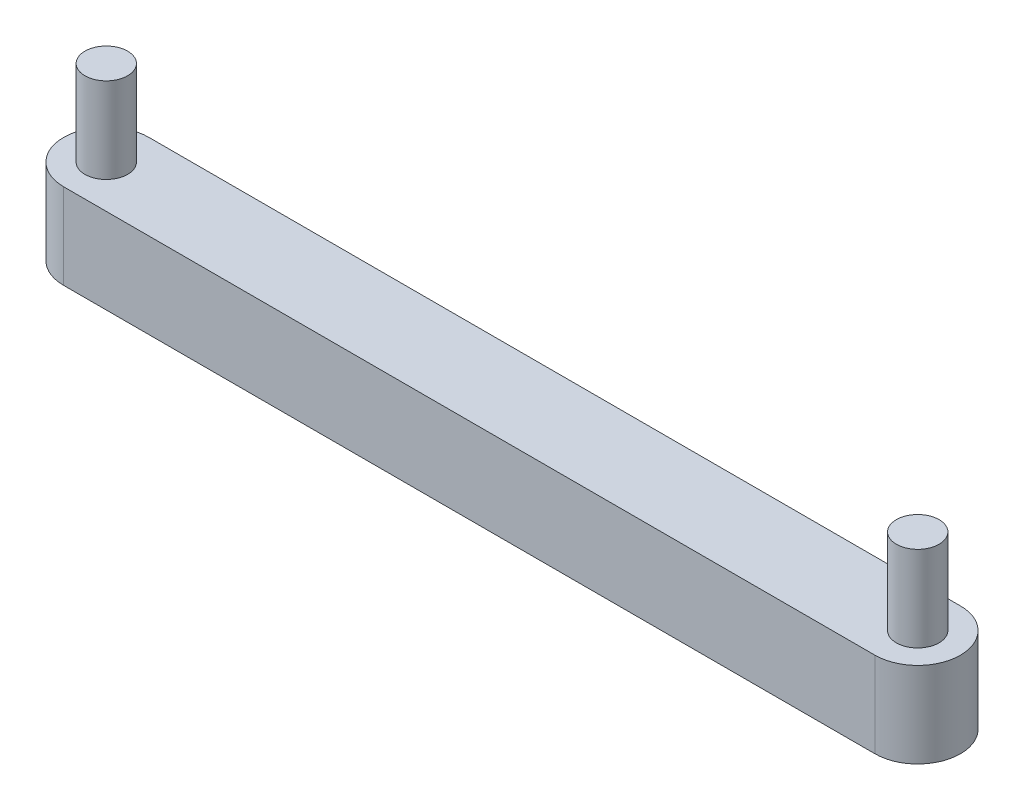
ISO-10303-21;
HEADER;
FILE_DESCRIPTION(('STEP AP214'),'2;1');
FILE_NAME('part.step','',(''),(''),'','','');
FILE_SCHEMA(('AUTOMOTIVE_DESIGN { 1 0 10303 214 1 1 1 1 }'));
ENDSEC;
DATA;
#1=APPLICATION_CONTEXT('core data for automotive mechanical design processes');
#2=APPLICATION_PROTOCOL_DEFINITION('international standard','automotive_design',2000,#1);
#3=PRODUCT_CONTEXT('',#1,'mechanical');
#4=PRODUCT('Part','Part','',(#3));
#5=PRODUCT_RELATED_PRODUCT_CATEGORY('part','',(#4));
#6=PRODUCT_DEFINITION_FORMATION('','',#4);
#7=PRODUCT_DEFINITION_CONTEXT('part definition',#1,'design');
#8=PRODUCT_DEFINITION('design','',#6,#7);
#9=PRODUCT_DEFINITION_SHAPE('','',#8);
#10=(LENGTH_UNIT() NAMED_UNIT(*) SI_UNIT(.MILLI.,.METRE.));
#11=(NAMED_UNIT(*) PLANE_ANGLE_UNIT() SI_UNIT($,.RADIAN.));
#12=(NAMED_UNIT(*) SI_UNIT($,.STERADIAN.) SOLID_ANGLE_UNIT());
#13=UNCERTAINTY_MEASURE_WITH_UNIT(LENGTH_MEASURE(1.E-05),#10,'distance_accuracy_value','');
#14=(GEOMETRIC_REPRESENTATION_CONTEXT(3) GLOBAL_UNCERTAINTY_ASSIGNED_CONTEXT((#13)) GLOBAL_UNIT_ASSIGNED_CONTEXT((#10,
#11,#12)) REPRESENTATION_CONTEXT('',''));
#15=CARTESIAN_POINT('',(0.,0.,0.));
#16=DIRECTION('',(0.,0.,1.));
#17=DIRECTION('',(1.,0.,0.));
#18=AXIS2_PLACEMENT_3D('',#15,#16,#17);
#19=CARTESIAN_POINT('',(-47.5,10.,0.));
#20=DIRECTION('',(0.,-1.,0.));
#21=DIRECTION('',(0.,0.,-1.));
#22=AXIS2_PLACEMENT_3D('',#19,#20,#21);
#23=CYLINDRICAL_SURFACE('',#22,5.);
#24=CARTESIAN_POINT('',(-47.5,0.,0.));
#25=DIRECTION('',(0.,1.,0.));
#26=DIRECTION('',(0.,0.,1.));
#27=AXIS2_PLACEMENT_3D('',#24,#25,#26);
#28=CIRCLE('',#27,5.);
#29=CARTESIAN_POINT('',(-47.5,0.,-5.));
#30=VERTEX_POINT('',#29);
#31=CARTESIAN_POINT('',(-47.5,0.,5.));
#32=VERTEX_POINT('',#31);
#33=EDGE_CURVE('E95',#30,#32,#28,.T.);
#34=ORIENTED_EDGE('',*,*,#33,.T.);
#35=DIRECTION('',(0.,-1.,0.));
#36=VECTOR('',#35,1.);
#37=CARTESIAN_POINT('',(-47.5,10.,5.));
#38=LINE('',#37,#36);
#39=CARTESIAN_POINT('',(-47.5,10.,5.));
#40=VERTEX_POINT('',#39);
#41=EDGE_CURVE('E11',#40,#32,#38,.T.);
#42=ORIENTED_EDGE('',*,*,#41,.F.);
#43=CARTESIAN_POINT('',(-47.5,10.,0.));
#44=DIRECTION('',(0.,1.,0.));
#45=DIRECTION('',(0.,0.,1.));
#46=AXIS2_PLACEMENT_3D('',#43,#44,#45);
#47=CIRCLE('',#46,5.);
#48=CARTESIAN_POINT('',(-47.5,10.,-5.));
#49=VERTEX_POINT('',#48);
#50=EDGE_CURVE('E83',#49,#40,#47,.T.);
#51=ORIENTED_EDGE('',*,*,#50,.F.);
#52=DIRECTION('',(0.,-1.,0.));
#53=VECTOR('',#52,1.);
#54=CARTESIAN_POINT('',(-47.5,10.,-5.));
#55=LINE('',#54,#53);
#56=EDGE_CURVE('E91',#49,#30,#55,.T.);
#57=ORIENTED_EDGE('',*,*,#56,.T.);
#58=EDGE_LOOP('',(#34,#42,#51,#57));
#59=FACE_BOUND('',#58,.T.);
#60=ADVANCED_FACE('F32',(#59),#23,.T.);
#61=CARTESIAN_POINT('',(-47.5,10.,5.));
#62=DIRECTION('',(0.,0.,-1.));
#63=DIRECTION('',(-1.,0.,0.));
#64=AXIS2_PLACEMENT_3D('',#61,#62,#63);
#65=PLANE('',#64);
#66=DIRECTION('',(1.,0.,0.));
#67=VECTOR('',#66,1.);
#68=CARTESIAN_POINT('',(-47.5,0.,5.));
#69=LINE('',#68,#67);
#70=CARTESIAN_POINT('',(47.5,0.,5.));
#71=VERTEX_POINT('',#70);
#72=EDGE_CURVE('E87',#32,#71,#69,.T.);
#73=ORIENTED_EDGE('',*,*,#72,.T.);
#74=DIRECTION('',(0.,-1.,0.));
#75=VECTOR('',#74,1.);
#76=CARTESIAN_POINT('',(47.5,10.,5.));
#77=LINE('',#76,#75);
#78=CARTESIAN_POINT('',(47.5,10.,5.));
#79=VERTEX_POINT('',#78);
#80=EDGE_CURVE('E40',#79,#71,#77,.T.);
#81=ORIENTED_EDGE('',*,*,#80,.F.);
#82=DIRECTION('',(1.,0.,0.));
#83=VECTOR('',#82,1.);
#84=CARTESIAN_POINT('',(-47.5,10.,5.));
#85=LINE('',#84,#83);
#86=EDGE_CURVE('E78',#40,#79,#85,.T.);
#87=ORIENTED_EDGE('',*,*,#86,.F.);
#88=ORIENTED_EDGE('',*,*,#41,.T.);
#89=EDGE_LOOP('',(#73,#81,#87,#88));
#90=FACE_BOUND('',#89,.T.);
#91=ADVANCED_FACE('F86',(#90),#65,.F.);
#92=CARTESIAN_POINT('',(47.5,10.,0.));
#93=DIRECTION('',(0.,-1.,0.));
#94=DIRECTION('',(0.,0.,-1.));
#95=AXIS2_PLACEMENT_3D('',#92,#93,#94);
#96=CYLINDRICAL_SURFACE('',#95,5.);
#97=CARTESIAN_POINT('',(47.5,0.,0.));
#98=DIRECTION('',(0.,1.,0.));
#99=DIRECTION('',(0.,0.,1.));
#100=AXIS2_PLACEMENT_3D('',#97,#98,#99);
#101=CIRCLE('',#100,5.);
#102=CARTESIAN_POINT('',(47.5,0.,-5.));
#103=VERTEX_POINT('',#102);
#104=EDGE_CURVE('E65',#71,#103,#101,.T.);
#105=ORIENTED_EDGE('',*,*,#104,.T.);
#106=DIRECTION('',(0.,-1.,0.));
#107=VECTOR('',#106,1.);
#108=CARTESIAN_POINT('',(47.5,10.,-5.));
#109=LINE('',#108,#107);
#110=CARTESIAN_POINT('',(47.5,10.,-5.));
#111=VERTEX_POINT('',#110);
#112=EDGE_CURVE('E88',#111,#103,#109,.T.);
#113=ORIENTED_EDGE('',*,*,#112,.F.);
#114=CARTESIAN_POINT('',(47.5,10.,0.));
#115=DIRECTION('',(0.,1.,0.));
#116=DIRECTION('',(0.,0.,1.));
#117=AXIS2_PLACEMENT_3D('',#114,#115,#116);
#118=CIRCLE('',#117,5.);
#119=EDGE_CURVE('E81',#79,#111,#118,.T.);
#120=ORIENTED_EDGE('',*,*,#119,.F.);
#121=ORIENTED_EDGE('',*,*,#80,.T.);
#122=EDGE_LOOP('',(#105,#113,#120,#121));
#123=FACE_BOUND('',#122,.T.);
#124=ADVANCED_FACE('F89',(#123),#96,.T.);
#125=CARTESIAN_POINT('',(-47.5,10.,-5.));
#126=DIRECTION('',(0.,0.,1.));
#127=DIRECTION('',(1.,0.,0.));
#128=AXIS2_PLACEMENT_3D('',#125,#126,#127);
#129=PLANE('',#128);
#130=DIRECTION('',(-1.,0.,0.));
#131=VECTOR('',#130,1.);
#132=CARTESIAN_POINT('',(-47.5,0.,-5.));
#133=LINE('',#132,#131);
#134=EDGE_CURVE('E71',#103,#30,#133,.T.);
#135=ORIENTED_EDGE('',*,*,#134,.T.);
#136=ORIENTED_EDGE('',*,*,#56,.F.);
#137=DIRECTION('',(-1.,0.,0.));
#138=VECTOR('',#137,1.);
#139=CARTESIAN_POINT('',(-47.5,10.,-5.));
#140=LINE('',#139,#138);
#141=EDGE_CURVE('E48',#111,#49,#140,.T.);
#142=ORIENTED_EDGE('',*,*,#141,.F.);
#143=ORIENTED_EDGE('',*,*,#112,.T.);
#144=EDGE_LOOP('',(#135,#136,#142,#143));
#145=FACE_BOUND('',#144,.T.);
#146=ADVANCED_FACE('F103',(#145),#129,.F.);
#147=CARTESIAN_POINT('',(-47.5,10.,0.));
#148=DIRECTION('',(0.,1.,0.));
#149=DIRECTION('',(0.,0.,1.));
#150=AXIS2_PLACEMENT_3D('',#147,#148,#149);
#151=PLANE('',#150);
#152=CARTESIAN_POINT('',(47.5,10.,0.));
#153=DIRECTION('',(0.,1.,0.));
#154=DIRECTION('',(0.,0.,1.));
#155=AXIS2_PLACEMENT_3D('',#152,#153,#154);
#156=CIRCLE('',#155,2.5);
#157=CARTESIAN_POINT('',(47.5,10.,2.5));
#158=VERTEX_POINT('',#157);
#159=EDGE_CURVE('E115',#158,#158,#156,.T.);
#160=ORIENTED_EDGE('',*,*,#159,.F.);
#161=EDGE_LOOP('',(#160));
#162=FACE_BOUND('',#161,.T.);
#163=CARTESIAN_POINT('',(-47.5,10.,0.));
#164=DIRECTION('',(0.,1.,0.));
#165=DIRECTION('',(0.,0.,1.));
#166=AXIS2_PLACEMENT_3D('',#163,#164,#165);
#167=CIRCLE('',#166,2.5);
#168=CARTESIAN_POINT('',(-47.5,10.,2.5));
#169=VERTEX_POINT('',#168);
#170=EDGE_CURVE('E109',#169,#169,#167,.T.);
#171=ORIENTED_EDGE('',*,*,#170,.F.);
#172=EDGE_LOOP('',(#171));
#173=FACE_BOUND('',#172,.T.);
#174=ORIENTED_EDGE('',*,*,#50,.T.);
#175=ORIENTED_EDGE('',*,*,#86,.T.);
#176=ORIENTED_EDGE('',*,*,#119,.T.);
#177=ORIENTED_EDGE('',*,*,#141,.T.);
#178=EDGE_LOOP('',(#174,#175,#176,#177));
#179=FACE_BOUND('',#178,.T.);
#180=ADVANCED_FACE('F79',(#162,#173,#179),#151,.T.);
#181=CARTESIAN_POINT('',(-47.5,0.,0.));
#182=DIRECTION('',(0.,1.,0.));
#183=DIRECTION('',(0.,0.,1.));
#184=AXIS2_PLACEMENT_3D('',#181,#182,#183);
#185=PLANE('',#184);
#186=ORIENTED_EDGE('',*,*,#33,.F.);
#187=ORIENTED_EDGE('',*,*,#134,.F.);
#188=ORIENTED_EDGE('',*,*,#104,.F.);
#189=ORIENTED_EDGE('',*,*,#72,.F.);
#190=EDGE_LOOP('',(#186,#187,#188,#189));
#191=FACE_BOUND('',#190,.T.);
#192=ADVANCED_FACE('F106',(#191),#185,.F.);
#193=CARTESIAN_POINT('',(-47.5,20.,0.));
#194=DIRECTION('',(0.,-1.,0.));
#195=DIRECTION('',(0.,0.,-1.));
#196=AXIS2_PLACEMENT_3D('',#193,#194,#195);
#197=CYLINDRICAL_SURFACE('',#196,2.5);
#198=CARTESIAN_POINT('',(-47.5,20.,0.));
#199=DIRECTION('',(0.,1.,0.));
#200=DIRECTION('',(0.,0.,1.));
#201=AXIS2_PLACEMENT_3D('',#198,#199,#200);
#202=CIRCLE('',#201,2.5);
#203=CARTESIAN_POINT('',(-47.5,20.,2.5));
#204=VERTEX_POINT('',#203);
#205=EDGE_CURVE('E98',#204,#204,#202,.T.);
#206=ORIENTED_EDGE('',*,*,#205,.F.);
#207=EDGE_LOOP('',(#206));
#208=FACE_BOUND('',#207,.T.);
#209=ORIENTED_EDGE('',*,*,#170,.T.);
#210=EDGE_LOOP('',(#209));
#211=FACE_BOUND('',#210,.T.);
#212=ADVANCED_FACE('F135',(#208,#211),#197,.T.);
#213=CARTESIAN_POINT('',(-47.5,20.,0.));
#214=DIRECTION('',(0.,1.,0.));
#215=DIRECTION('',(0.,0.,1.));
#216=AXIS2_PLACEMENT_3D('',#213,#214,#215);
#217=PLANE('',#216);
#218=ORIENTED_EDGE('',*,*,#205,.T.);
#219=EDGE_LOOP('',(#218));
#220=FACE_BOUND('',#219,.T.);
#221=ADVANCED_FACE('F126',(#220),#217,.T.);
#222=CARTESIAN_POINT('',(47.5,20.,0.));
#223=DIRECTION('',(0.,-1.,0.));
#224=DIRECTION('',(0.,0.,-1.));
#225=AXIS2_PLACEMENT_3D('',#222,#223,#224);
#226=CYLINDRICAL_SURFACE('',#225,2.5);
#227=CARTESIAN_POINT('',(47.5,20.,0.));
#228=DIRECTION('',(0.,1.,0.));
#229=DIRECTION('',(0.,0.,1.));
#230=AXIS2_PLACEMENT_3D('',#227,#228,#229);
#231=CIRCLE('',#230,2.5);
#232=CARTESIAN_POINT('',(47.5,20.,2.5));
#233=VERTEX_POINT('',#232);
#234=EDGE_CURVE('E112',#233,#233,#231,.T.);
#235=ORIENTED_EDGE('',*,*,#234,.F.);
#236=EDGE_LOOP('',(#235));
#237=FACE_BOUND('',#236,.T.);
#238=ORIENTED_EDGE('',*,*,#159,.T.);
#239=EDGE_LOOP('',(#238));
#240=FACE_BOUND('',#239,.T.);
#241=ADVANCED_FACE('F123',(#237,#240),#226,.T.);
#242=CARTESIAN_POINT('',(47.5,20.,0.));
#243=DIRECTION('',(0.,1.,0.));
#244=DIRECTION('',(0.,0.,1.));
#245=AXIS2_PLACEMENT_3D('',#242,#243,#244);
#246=PLANE('',#245);
#247=ORIENTED_EDGE('',*,*,#234,.T.);
#248=EDGE_LOOP('',(#247));
#249=FACE_BOUND('',#248,.T.);
#250=ADVANCED_FACE('F121',(#249),#246,.T.);
#251=CLOSED_SHELL('',(#60,#91,#124,#146,#180,#192,#212,#221,#241,#250));
#252=MANIFOLD_SOLID_BREP('B2',#251);
#253=ADVANCED_BREP_SHAPE_REPRESENTATION('',(#18,#252),#14);
#254=SHAPE_DEFINITION_REPRESENTATION(#9,#253);
ENDSEC;
END-ISO-10303-21;
